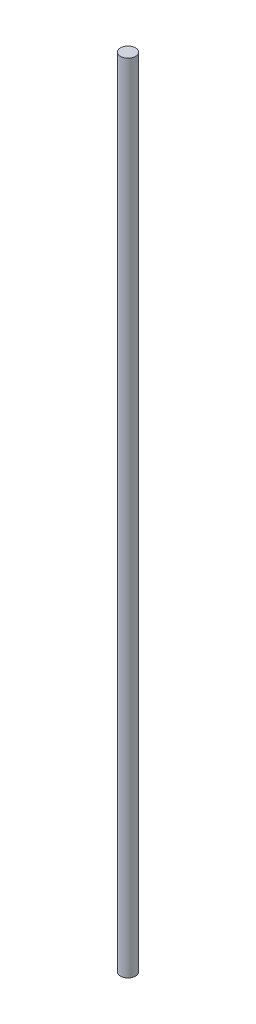
ISO-10303-21;
HEADER;
FILE_DESCRIPTION(('STEP AP214'),'2;1');
FILE_NAME('part.step','',(''),(''),'','','');
FILE_SCHEMA(('AUTOMOTIVE_DESIGN { 1 0 10303 214 1 1 1 1 }'));
ENDSEC;
DATA;
#1=APPLICATION_CONTEXT('core data for automotive mechanical design processes');
#2=APPLICATION_PROTOCOL_DEFINITION('international standard','automotive_design',2000,#1);
#3=PRODUCT_CONTEXT('',#1,'mechanical');
#4=PRODUCT('Part','Part','',(#3));
#5=PRODUCT_RELATED_PRODUCT_CATEGORY('part','',(#4));
#6=PRODUCT_DEFINITION_FORMATION('','',#4);
#7=PRODUCT_DEFINITION_CONTEXT('part definition',#1,'design');
#8=PRODUCT_DEFINITION('design','',#6,#7);
#9=PRODUCT_DEFINITION_SHAPE('','',#8);
#10=(LENGTH_UNIT() NAMED_UNIT(*) SI_UNIT(.MILLI.,.METRE.));
#11=(NAMED_UNIT(*) PLANE_ANGLE_UNIT() SI_UNIT($,.RADIAN.));
#12=(NAMED_UNIT(*) SI_UNIT($,.STERADIAN.) SOLID_ANGLE_UNIT());
#13=UNCERTAINTY_MEASURE_WITH_UNIT(LENGTH_MEASURE(1.E-05),#10,'distance_accuracy_value','');
#14=(GEOMETRIC_REPRESENTATION_CONTEXT(3) GLOBAL_UNCERTAINTY_ASSIGNED_CONTEXT((#13)) GLOBAL_UNIT_ASSIGNED_CONTEXT((#10,
#11,#12)) REPRESENTATION_CONTEXT('',''));
#15=CARTESIAN_POINT('',(0.,0.,0.));
#16=DIRECTION('',(0.,0.,1.));
#17=DIRECTION('',(1.,0.,0.));
#18=AXIS2_PLACEMENT_3D('',#15,#16,#17);
#19=CARTESIAN_POINT('',(0.,160.,0.));
#20=DIRECTION('',(0.,-1.,0.));
#21=DIRECTION('',(0.,0.,-1.));
#22=AXIS2_PLACEMENT_3D('',#19,#20,#21);
#23=CYLINDRICAL_SURFACE('',#22,1.5);
#24=CARTESIAN_POINT('',(0.,160.,0.));
#25=DIRECTION('',(0.,1.,0.));
#26=DIRECTION('',(0.,0.,1.));
#27=AXIS2_PLACEMENT_3D('',#24,#25,#26);
#28=CIRCLE('',#27,1.5);
#29=CARTESIAN_POINT('',(0.,160.,1.5));
#30=VERTEX_POINT('',#29);
#31=EDGE_CURVE('E10',#30,#30,#28,.T.);
#32=ORIENTED_EDGE('',*,*,#31,.F.);
#33=EDGE_LOOP('',(#32));
#34=FACE_BOUND('',#33,.T.);
#35=CARTESIAN_POINT('',(0.,0.,0.));
#36=DIRECTION('',(0.,1.,0.));
#37=DIRECTION('',(0.,0.,1.));
#38=AXIS2_PLACEMENT_3D('',#35,#36,#37);
#39=CIRCLE('',#38,1.5);
#40=CARTESIAN_POINT('',(0.,0.,1.5));
#41=VERTEX_POINT('',#40);
#42=EDGE_CURVE('E40',#41,#41,#39,.T.);
#43=ORIENTED_EDGE('',*,*,#42,.T.);
#44=EDGE_LOOP('',(#43));
#45=FACE_BOUND('',#44,.T.);
#46=ADVANCED_FACE('F37',(#34,#45),#23,.T.);
#47=CARTESIAN_POINT('',(0.,160.,0.));
#48=DIRECTION('',(0.,1.,0.));
#49=DIRECTION('',(0.,0.,1.));
#50=AXIS2_PLACEMENT_3D('',#47,#48,#49);
#51=PLANE('',#50);
#52=ORIENTED_EDGE('',*,*,#31,.T.);
#53=EDGE_LOOP('',(#52));
#54=FACE_BOUND('',#53,.T.);
#55=ADVANCED_FACE('F54',(#54),#51,.T.);
#56=CARTESIAN_POINT('',(0.,0.,0.));
#57=DIRECTION('',(0.,1.,0.));
#58=DIRECTION('',(0.,0.,1.));
#59=AXIS2_PLACEMENT_3D('',#56,#57,#58);
#60=PLANE('',#59);
#61=ORIENTED_EDGE('',*,*,#42,.F.);
#62=EDGE_LOOP('',(#61));
#63=FACE_BOUND('',#62,.T.);
#64=ADVANCED_FACE('F52',(#63),#60,.F.);
#65=CLOSED_SHELL('',(#46,#55,#64));
#66=MANIFOLD_SOLID_BREP('B2',#65);
#67=ADVANCED_BREP_SHAPE_REPRESENTATION('',(#18,#66),#14);
#68=SHAPE_DEFINITION_REPRESENTATION(#9,#67);
ENDSEC;
END-ISO-10303-21;
